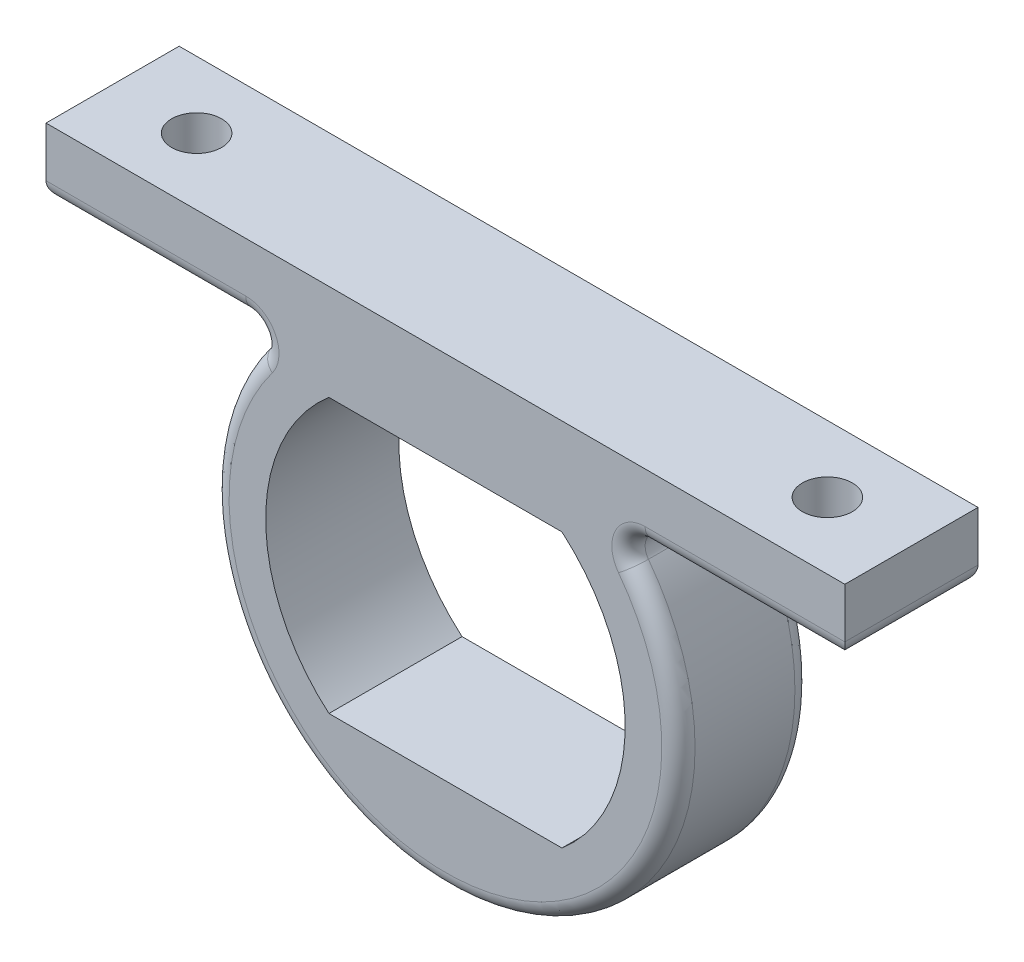
ISO-10303-21;
HEADER;
FILE_DESCRIPTION(('STEP AP214'),'2;1');
FILE_NAME('part.step','',(''),(''),'','','');
FILE_SCHEMA(('AUTOMOTIVE_DESIGN { 1 0 10303 214 1 1 1 1 }'));
ENDSEC;
DATA;
#1=APPLICATION_CONTEXT('core data for automotive mechanical design processes');
#2=APPLICATION_PROTOCOL_DEFINITION('international standard','automotive_design',2000,#1);
#3=PRODUCT_CONTEXT('',#1,'mechanical');
#4=PRODUCT('Part','Part','',(#3));
#5=PRODUCT_RELATED_PRODUCT_CATEGORY('part','',(#4));
#6=PRODUCT_DEFINITION_FORMATION('','',#4);
#7=PRODUCT_DEFINITION_CONTEXT('part definition',#1,'design');
#8=PRODUCT_DEFINITION('design','',#6,#7);
#9=PRODUCT_DEFINITION_SHAPE('','',#8);
#10=(LENGTH_UNIT() NAMED_UNIT(*) SI_UNIT(.MILLI.,.METRE.));
#11=(NAMED_UNIT(*) PLANE_ANGLE_UNIT() SI_UNIT($,.RADIAN.));
#12=(NAMED_UNIT(*) SI_UNIT($,.STERADIAN.) SOLID_ANGLE_UNIT());
#13=UNCERTAINTY_MEASURE_WITH_UNIT(LENGTH_MEASURE(1.E-05),#10,'distance_accuracy_value','');
#14=(GEOMETRIC_REPRESENTATION_CONTEXT(3) GLOBAL_UNCERTAINTY_ASSIGNED_CONTEXT((#13)) GLOBAL_UNIT_ASSIGNED_CONTEXT((#10,
#11,#12)) REPRESENTATION_CONTEXT('',''));
#15=CARTESIAN_POINT('',(0.,0.,0.));
#16=DIRECTION('',(0.,0.,1.));
#17=DIRECTION('',(1.,0.,0.));
#18=AXIS2_PLACEMENT_3D('',#15,#16,#17);
#19=CARTESIAN_POINT('',(0.,14.,8.));
#20=DIRECTION('',(0.,-1.,0.));
#21=DIRECTION('',(1.,0.,0.));
#22=AXIS2_PLACEMENT_3D('',#19,#20,#21);
#23=PLANE('',#22);
#24=CARTESIAN_POINT('',(18.9494897427832,14.,4.));
#25=DIRECTION('',(0.,-1.,0.));
#26=DIRECTION('',(0.,0.,-1.));
#27=AXIS2_PLACEMENT_3D('',#24,#25,#26);
#28=CIRCLE('',#27,1.5);
#29=CARTESIAN_POINT('',(18.9494897427832,14.,2.5));
#30=VERTEX_POINT('',#29);
#31=EDGE_CURVE('E445',#30,#30,#28,.T.);
#32=ORIENTED_EDGE('',*,*,#31,.T.);
#33=EDGE_LOOP('',(#32));
#34=FACE_BOUND('',#33,.T.);
#35=CARTESIAN_POINT('',(-18.9494897427832,14.,4.));
#36=DIRECTION('',(0.,-1.,0.));
#37=DIRECTION('',(0.,0.,-1.));
#38=AXIS2_PLACEMENT_3D('',#35,#36,#37);
#39=CIRCLE('',#38,1.5);
#40=CARTESIAN_POINT('',(-18.9494897427832,14.,2.5));
#41=VERTEX_POINT('',#40);
#42=EDGE_CURVE('E279',#41,#41,#39,.T.);
#43=ORIENTED_EDGE('',*,*,#42,.T.);
#44=EDGE_LOOP('',(#43));
#45=FACE_BOUND('',#44,.T.);
#46=DIRECTION('',(-1.,0.,0.));
#47=VECTOR('',#46,1.);
#48=CARTESIAN_POINT('',(0.,14.,0.));
#49=LINE('',#48,#47);
#50=CARTESIAN_POINT('',(24.,14.,0.));
#51=VERTEX_POINT('',#50);
#52=CARTESIAN_POINT('',(-24.,14.,0.));
#53=VERTEX_POINT('',#52);
#54=EDGE_CURVE('E212',#51,#53,#49,.T.);
#55=ORIENTED_EDGE('',*,*,#54,.T.);
#56=DIRECTION('',(0.,0.,-1.));
#57=VECTOR('',#56,1.);
#58=CARTESIAN_POINT('',(-24.,14.,8.));
#59=LINE('',#58,#57);
#60=CARTESIAN_POINT('',(-24.,14.,8.));
#61=VERTEX_POINT('',#60);
#62=EDGE_CURVE('E225',#61,#53,#59,.T.);
#63=ORIENTED_EDGE('',*,*,#62,.F.);
#64=DIRECTION('',(1.,0.,0.));
#65=VECTOR('',#64,1.);
#66=CARTESIAN_POINT('',(0.,14.,8.));
#67=LINE('',#66,#65);
#68=CARTESIAN_POINT('',(24.,14.,8.));
#69=VERTEX_POINT('',#68);
#70=EDGE_CURVE('E208',#61,#69,#67,.T.);
#71=ORIENTED_EDGE('',*,*,#70,.T.);
#72=DIRECTION('',(0.,0.,-1.));
#73=VECTOR('',#72,1.);
#74=CARTESIAN_POINT('',(24.,14.,8.));
#75=LINE('',#74,#73);
#76=EDGE_CURVE('E218',#69,#51,#75,.T.);
#77=ORIENTED_EDGE('',*,*,#76,.T.);
#78=EDGE_LOOP('',(#55,#63,#71,#77));
#79=FACE_BOUND('',#78,.T.);
#80=ADVANCED_FACE('F35',(#34,#45,#79),#23,.F.);
#81=CARTESIAN_POINT('',(-24.,14.,8.));
#82=DIRECTION('',(1.,0.,0.));
#83=DIRECTION('',(0.,0.,-1.));
#84=AXIS2_PLACEMENT_3D('',#81,#82,#83);
#85=PLANE('',#84);
#86=DIRECTION('',(0.,-1.,0.));
#87=VECTOR('',#86,1.);
#88=CARTESIAN_POINT('',(-24.,14.,0.));
#89=LINE('',#88,#87);
#90=CARTESIAN_POINT('',(-24.,11.,0.));
#91=VERTEX_POINT('',#90);
#92=EDGE_CURVE('E221',#53,#91,#89,.T.);
#93=ORIENTED_EDGE('',*,*,#92,.T.);
#94=DIRECTION('',(0.,0.,-1.));
#95=VECTOR('',#94,1.);
#96=CARTESIAN_POINT('',(-24.,11.,8.));
#97=LINE('',#96,#95);
#98=CARTESIAN_POINT('',(-24.,11.,8.));
#99=VERTEX_POINT('',#98);
#100=EDGE_CURVE('E269',#91,#99,#97,.F.);
#101=ORIENTED_EDGE('',*,*,#100,.T.);
#102=DIRECTION('',(0.,-1.,0.));
#103=VECTOR('',#102,1.);
#104=CARTESIAN_POINT('',(-24.,14.,8.));
#105=LINE('',#104,#103);
#106=EDGE_CURVE('E215',#61,#99,#105,.T.);
#107=ORIENTED_EDGE('',*,*,#106,.F.);
#108=ORIENTED_EDGE('',*,*,#62,.T.);
#109=EDGE_LOOP('',(#93,#101,#107,#108));
#110=FACE_BOUND('',#109,.T.);
#111=ADVANCED_FACE('F343',(#110),#85,.F.);
#112=CARTESIAN_POINT('',(-24.,10.,8.));
#113=DIRECTION('',(0.,1.,0.));
#114=DIRECTION('',(0.,0.,1.));
#115=AXIS2_PLACEMENT_3D('',#112,#113,#114);
#116=PLANE('',#115);
#117=CARTESIAN_POINT('',(-18.9494897427832,10.,4.));
#118=DIRECTION('',(0.,-1.,0.));
#119=DIRECTION('',(0.,0.,-1.));
#120=AXIS2_PLACEMENT_3D('',#117,#118,#119);
#121=CIRCLE('',#120,1.5);
#122=CARTESIAN_POINT('',(-18.9494897427832,10.,2.5));
#123=VERTEX_POINT('',#122);
#124=EDGE_CURVE('E192',#123,#123,#121,.T.);
#125=ORIENTED_EDGE('',*,*,#124,.F.);
#126=EDGE_LOOP('',(#125));
#127=FACE_BOUND('',#126,.T.);
#128=DIRECTION('',(1.,0.,0.));
#129=VECTOR('',#128,1.);
#130=CARTESIAN_POINT('',(-24.,10.,1.));
#131=LINE('',#130,#129);
#132=CARTESIAN_POINT('',(-23.,10.,1.));
#133=VERTEX_POINT('',#132);
#134=CARTESIAN_POINT('',(-12.,10.,1.));
#135=VERTEX_POINT('',#134);
#136=EDGE_CURVE('E239',#133,#135,#131,.T.);
#137=ORIENTED_EDGE('',*,*,#136,.T.);
#138=DIRECTION('',(0.,0.,1.));
#139=VECTOR('',#138,1.);
#140=CARTESIAN_POINT('',(-12.,10.,8.));
#141=LINE('',#140,#139);
#142=CARTESIAN_POINT('',(-12.,10.,7.));
#143=VERTEX_POINT('',#142);
#144=EDGE_CURVE('E244',#135,#143,#141,.T.);
#145=ORIENTED_EDGE('',*,*,#144,.T.);
#146=DIRECTION('',(1.,0.,0.));
#147=VECTOR('',#146,1.);
#148=CARTESIAN_POINT('',(-24.,10.,7.));
#149=LINE('',#148,#147);
#150=CARTESIAN_POINT('',(-23.,10.,7.));
#151=VERTEX_POINT('',#150);
#152=EDGE_CURVE('E241',#143,#151,#149,.F.);
#153=ORIENTED_EDGE('',*,*,#152,.T.);
#154=DIRECTION('',(0.,0.,-1.));
#155=VECTOR('',#154,1.);
#156=CARTESIAN_POINT('',(-23.,10.,8.));
#157=LINE('',#156,#155);
#158=EDGE_CURVE('E237',#151,#133,#157,.T.);
#159=ORIENTED_EDGE('',*,*,#158,.T.);
#160=EDGE_LOOP('',(#137,#145,#153,#159));
#161=FACE_BOUND('',#160,.T.);
#162=ADVANCED_FACE('F392',(#127,#161),#116,.F.);
#163=CARTESIAN_POINT('',(0.,0.,8.));
#164=DIRECTION('',(0.,0.,-1.));
#165=DIRECTION('',(-1.,0.,0.));
#166=AXIS2_PLACEMENT_3D('',#163,#164,#165);
#167=CYLINDRICAL_SURFACE('',#166,14.);
#168=CARTESIAN_POINT('',(0.,0.,7.));
#169=DIRECTION('',(0.,0.,1.));
#170=DIRECTION('',(1.,0.,0.));
#171=AXIS2_PLACEMENT_3D('',#168,#169,#170);
#172=CIRCLE('',#171,14.);
#173=CARTESIAN_POINT('',(11.2,8.4,7.));
#174=VERTEX_POINT('',#173);
#175=CARTESIAN_POINT('',(-11.2,8.4,7.));
#176=VERTEX_POINT('',#175);
#177=EDGE_CURVE('E52',#174,#176,#172,.F.);
#178=ORIENTED_EDGE('',*,*,#177,.T.);
#179=DIRECTION('',(0.,0.,-1.));
#180=VECTOR('',#179,1.);
#181=CARTESIAN_POINT('',(-11.2,8.4,8.));
#182=LINE('',#181,#180);
#183=CARTESIAN_POINT('',(-11.2,8.4,1.));
#184=VERTEX_POINT('',#183);
#185=EDGE_CURVE('E265',#176,#184,#182,.T.);
#186=ORIENTED_EDGE('',*,*,#185,.T.);
#187=CARTESIAN_POINT('',(0.,0.,1.));
#188=DIRECTION('',(0.,0.,1.));
#189=DIRECTION('',(1.,0.,0.));
#190=AXIS2_PLACEMENT_3D('',#187,#188,#189);
#191=CIRCLE('',#190,14.);
#192=CARTESIAN_POINT('',(11.2,8.4,1.));
#193=VERTEX_POINT('',#192);
#194=EDGE_CURVE('E261',#184,#193,#191,.T.);
#195=ORIENTED_EDGE('',*,*,#194,.T.);
#196=DIRECTION('',(0.,0.,-1.));
#197=VECTOR('',#196,1.);
#198=CARTESIAN_POINT('',(11.2,8.4,8.));
#199=LINE('',#198,#197);
#200=EDGE_CURVE('E57',#193,#174,#199,.F.);
#201=ORIENTED_EDGE('',*,*,#200,.T.);
#202=EDGE_LOOP('',(#178,#186,#195,#201));
#203=FACE_BOUND('',#202,.T.);
#204=ADVANCED_FACE('F396',(#203),#167,.T.);
#205=CARTESIAN_POINT('',(24.,10.,8.));
#206=DIRECTION('',(0.,-1.,0.));
#207=DIRECTION('',(0.,0.,-1.));
#208=AXIS2_PLACEMENT_3D('',#205,#206,#207);
#209=PLANE('',#208);
#210=CARTESIAN_POINT('',(18.9494897427832,10.,4.));
#211=DIRECTION('',(0.,-1.,0.));
#212=DIRECTION('',(0.,0.,-1.));
#213=AXIS2_PLACEMENT_3D('',#210,#211,#212);
#214=CIRCLE('',#213,1.5);
#215=CARTESIAN_POINT('',(18.9494897427832,10.,2.5));
#216=VERTEX_POINT('',#215);
#217=EDGE_CURVE('E448',#216,#216,#214,.T.);
#218=ORIENTED_EDGE('',*,*,#217,.F.);
#219=EDGE_LOOP('',(#218));
#220=FACE_BOUND('',#219,.T.);
#221=DIRECTION('',(-1.,0.,0.));
#222=VECTOR('',#221,1.);
#223=CARTESIAN_POINT('',(24.,10.,7.));
#224=LINE('',#223,#222);
#225=CARTESIAN_POINT('',(23.,10.,7.));
#226=VERTEX_POINT('',#225);
#227=CARTESIAN_POINT('',(12.,10.,7.));
#228=VERTEX_POINT('',#227);
#229=EDGE_CURVE('E256',#226,#228,#224,.T.);
#230=ORIENTED_EDGE('',*,*,#229,.T.);
#231=DIRECTION('',(0.,0.,-1.));
#232=VECTOR('',#231,1.);
#233=CARTESIAN_POINT('',(12.,10.,8.));
#234=LINE('',#233,#232);
#235=CARTESIAN_POINT('',(12.,10.,1.));
#236=VERTEX_POINT('',#235);
#237=EDGE_CURVE('E259',#228,#236,#234,.T.);
#238=ORIENTED_EDGE('',*,*,#237,.T.);
#239=DIRECTION('',(-1.,0.,0.));
#240=VECTOR('',#239,1.);
#241=CARTESIAN_POINT('',(24.,10.,1.));
#242=LINE('',#241,#240);
#243=CARTESIAN_POINT('',(23.,10.,1.));
#244=VERTEX_POINT('',#243);
#245=EDGE_CURVE('E254',#236,#244,#242,.F.);
#246=ORIENTED_EDGE('',*,*,#245,.T.);
#247=DIRECTION('',(0.,0.,-1.));
#248=VECTOR('',#247,1.);
#249=CARTESIAN_POINT('',(23.,10.,8.));
#250=LINE('',#249,#248);
#251=EDGE_CURVE('E252',#244,#226,#250,.F.);
#252=ORIENTED_EDGE('',*,*,#251,.T.);
#253=EDGE_LOOP('',(#230,#238,#246,#252));
#254=FACE_BOUND('',#253,.T.);
#255=ADVANCED_FACE('F371',(#220,#254),#209,.T.);
#256=CARTESIAN_POINT('',(24.,14.,8.));
#257=DIRECTION('',(1.,0.,0.));
#258=DIRECTION('',(0.,0.,-1.));
#259=AXIS2_PLACEMENT_3D('',#256,#257,#258);
#260=PLANE('',#259);
#261=DIRECTION('',(0.,-1.,0.));
#262=VECTOR('',#261,1.);
#263=CARTESIAN_POINT('',(24.,14.,8.));
#264=LINE('',#263,#262);
#265=CARTESIAN_POINT('',(24.,11.,8.));
#266=VERTEX_POINT('',#265);
#267=EDGE_CURVE('E211',#69,#266,#264,.T.);
#268=ORIENTED_EDGE('',*,*,#267,.T.);
#269=DIRECTION('',(0.,0.,-1.));
#270=VECTOR('',#269,1.);
#271=CARTESIAN_POINT('',(24.,11.,8.));
#272=LINE('',#271,#270);
#273=CARTESIAN_POINT('',(24.,11.,0.));
#274=VERTEX_POINT('',#273);
#275=EDGE_CURVE('E267',#266,#274,#272,.T.);
#276=ORIENTED_EDGE('',*,*,#275,.T.);
#277=DIRECTION('',(0.,-1.,0.));
#278=VECTOR('',#277,1.);
#279=CARTESIAN_POINT('',(24.,14.,0.));
#280=LINE('',#279,#278);
#281=EDGE_CURVE('E204',#51,#274,#280,.T.);
#282=ORIENTED_EDGE('',*,*,#281,.F.);
#283=ORIENTED_EDGE('',*,*,#76,.F.);
#284=EDGE_LOOP('',(#268,#276,#282,#283));
#285=FACE_BOUND('',#284,.T.);
#286=ADVANCED_FACE('F334',(#285),#260,.T.);
#287=CARTESIAN_POINT('',(0.,0.,8.));
#288=DIRECTION('',(0.,0.,1.));
#289=DIRECTION('',(1.,0.,0.));
#290=AXIS2_PLACEMENT_3D('',#287,#288,#289);
#291=PLANE('',#290);
#292=CARTESIAN_POINT('',(0.,0.,8.));
#293=DIRECTION('',(0.,0.,1.));
#294=DIRECTION('',(1.,0.,0.));
#295=AXIS2_PLACEMENT_3D('',#292,#293,#294);
#296=CIRCLE('',#295,10.8);
#297=CARTESIAN_POINT('',(-7.,8.22435407798083,8.));
#298=VERTEX_POINT('',#297);
#299=CARTESIAN_POINT('',(-7.,-8.22435407798083,8.));
#300=VERTEX_POINT('',#299);
#301=EDGE_CURVE('E168',#298,#300,#296,.T.);
#302=ORIENTED_EDGE('',*,*,#301,.F.);
#303=DIRECTION('',(-1.,0.,0.));
#304=VECTOR('',#303,1.);
#305=CARTESIAN_POINT('',(-7.,8.22435407798083,8.));
#306=LINE('',#305,#304);
#307=CARTESIAN_POINT('',(7.,8.22435407798084,8.));
#308=VERTEX_POINT('',#307);
#309=EDGE_CURVE('E186',#308,#298,#306,.T.);
#310=ORIENTED_EDGE('',*,*,#309,.F.);
#311=CARTESIAN_POINT('',(0.,0.,8.));
#312=DIRECTION('',(0.,0.,1.));
#313=DIRECTION('',(-1.,0.,0.));
#314=AXIS2_PLACEMENT_3D('',#311,#312,#313);
#315=CIRCLE('',#314,10.8);
#316=CARTESIAN_POINT('',(7.,-8.22435407798083,8.));
#317=VERTEX_POINT('',#316);
#318=EDGE_CURVE('E189',#317,#308,#315,.T.);
#319=ORIENTED_EDGE('',*,*,#318,.F.);
#320=DIRECTION('',(1.,0.,0.));
#321=VECTOR('',#320,1.);
#322=CARTESIAN_POINT('',(-7.,-8.22435407798083,8.));
#323=LINE('',#322,#321);
#324=EDGE_CURVE('E198',#300,#317,#323,.T.);
#325=ORIENTED_EDGE('',*,*,#324,.F.);
#326=EDGE_LOOP('',(#302,#310,#319,#325));
#327=FACE_BOUND('',#326,.T.);
#328=CARTESIAN_POINT('',(0.,0.,8.));
#329=DIRECTION('',(0.,0.,1.));
#330=DIRECTION('',(1.,0.,0.));
#331=AXIS2_PLACEMENT_3D('',#328,#329,#330);
#332=CIRCLE('',#331,13.);
#333=CARTESIAN_POINT('',(-10.4,7.8,8.));
#334=VERTEX_POINT('',#333);
#335=CARTESIAN_POINT('',(10.4,7.8,8.));
#336=VERTEX_POINT('',#335);
#337=EDGE_CURVE('E228',#334,#336,#332,.T.);
#338=ORIENTED_EDGE('',*,*,#337,.T.);
#339=CARTESIAN_POINT('',(12.,9.,8.));
#340=DIRECTION('',(0.,0.,1.));
#341=DIRECTION('',(1.,0.,0.));
#342=AXIS2_PLACEMENT_3D('',#339,#340,#341);
#343=CIRCLE('',#342,2.);
#344=CARTESIAN_POINT('',(12.,11.,8.));
#345=VERTEX_POINT('',#344);
#346=EDGE_CURVE('E44',#336,#345,#343,.F.);
#347=ORIENTED_EDGE('',*,*,#346,.T.);
#348=DIRECTION('',(-1.,0.,0.));
#349=VECTOR('',#348,1.);
#350=CARTESIAN_POINT('',(0.,11.,8.));
#351=LINE('',#350,#349);
#352=EDGE_CURVE('E232',#345,#266,#351,.F.);
#353=ORIENTED_EDGE('',*,*,#352,.T.);
#354=ORIENTED_EDGE('',*,*,#267,.F.);
#355=ORIENTED_EDGE('',*,*,#70,.F.);
#356=ORIENTED_EDGE('',*,*,#106,.T.);
#357=DIRECTION('',(1.,0.,0.));
#358=VECTOR('',#357,1.);
#359=CARTESIAN_POINT('',(-9.79795897113272,11.,8.));
#360=LINE('',#359,#358);
#361=CARTESIAN_POINT('',(-12.,11.,8.));
#362=VERTEX_POINT('',#361);
#363=EDGE_CURVE('E234',#99,#362,#360,.T.);
#364=ORIENTED_EDGE('',*,*,#363,.T.);
#365=CARTESIAN_POINT('',(-12.,9.,8.));
#366=DIRECTION('',(0.,0.,1.));
#367=DIRECTION('',(1.,0.,0.));
#368=AXIS2_PLACEMENT_3D('',#365,#366,#367);
#369=CIRCLE('',#368,2.);
#370=EDGE_CURVE('E271',#362,#334,#369,.F.);
#371=ORIENTED_EDGE('',*,*,#370,.T.);
#372=EDGE_LOOP('',(#338,#347,#353,#354,#355,#356,#364,#371));
#373=FACE_BOUND('',#372,.T.);
#374=ADVANCED_FACE('F337',(#327,#373),#291,.T.);
#375=CARTESIAN_POINT('',(0.,0.,0.));
#376=DIRECTION('',(0.,0.,1.));
#377=DIRECTION('',(1.,0.,0.));
#378=AXIS2_PLACEMENT_3D('',#375,#376,#377);
#379=PLANE('',#378);
#380=DIRECTION('',(-1.,0.,0.));
#381=VECTOR('',#380,1.);
#382=CARTESIAN_POINT('',(-7.,8.22435407798083,0.));
#383=LINE('',#382,#381);
#384=CARTESIAN_POINT('',(7.,8.22435407798084,0.));
#385=VERTEX_POINT('',#384);
#386=CARTESIAN_POINT('',(-7.,8.22435407798083,0.));
#387=VERTEX_POINT('',#386);
#388=EDGE_CURVE('E173',#385,#387,#383,.T.);
#389=ORIENTED_EDGE('',*,*,#388,.T.);
#390=CARTESIAN_POINT('',(0.,0.,0.));
#391=DIRECTION('',(0.,0.,1.));
#392=DIRECTION('',(1.,0.,0.));
#393=AXIS2_PLACEMENT_3D('',#390,#391,#392);
#394=CIRCLE('',#393,10.8);
#395=CARTESIAN_POINT('',(-7.,-8.22435407798083,0.));
#396=VERTEX_POINT('',#395);
#397=EDGE_CURVE('E165',#387,#396,#394,.T.);
#398=ORIENTED_EDGE('',*,*,#397,.T.);
#399=DIRECTION('',(1.,0.,0.));
#400=VECTOR('',#399,1.);
#401=CARTESIAN_POINT('',(-7.,-8.22435407798083,0.));
#402=LINE('',#401,#400);
#403=CARTESIAN_POINT('',(7.,-8.22435407798083,0.));
#404=VERTEX_POINT('',#403);
#405=EDGE_CURVE('E177',#396,#404,#402,.T.);
#406=ORIENTED_EDGE('',*,*,#405,.T.);
#407=CARTESIAN_POINT('',(0.,0.,0.));
#408=DIRECTION('',(0.,0.,1.));
#409=DIRECTION('',(-1.,0.,0.));
#410=AXIS2_PLACEMENT_3D('',#407,#408,#409);
#411=CIRCLE('',#410,10.8);
#412=EDGE_CURVE('E181',#404,#385,#411,.T.);
#413=ORIENTED_EDGE('',*,*,#412,.T.);
#414=EDGE_LOOP('',(#389,#398,#406,#413));
#415=FACE_BOUND('',#414,.T.);
#416=CARTESIAN_POINT('',(0.,0.,0.));
#417=DIRECTION('',(0.,0.,1.));
#418=DIRECTION('',(1.,0.,0.));
#419=AXIS2_PLACEMENT_3D('',#416,#417,#418);
#420=CIRCLE('',#419,13.);
#421=CARTESIAN_POINT('',(10.4,7.8,0.));
#422=VERTEX_POINT('',#421);
#423=CARTESIAN_POINT('',(-10.4,7.8,0.));
#424=VERTEX_POINT('',#423);
#425=EDGE_CURVE('E246',#422,#424,#420,.F.);
#426=ORIENTED_EDGE('',*,*,#425,.T.);
#427=CARTESIAN_POINT('',(-12.,9.,0.));
#428=DIRECTION('',(0.,0.,1.));
#429=DIRECTION('',(1.,0.,0.));
#430=AXIS2_PLACEMENT_3D('',#427,#428,#429);
#431=CIRCLE('',#430,2.);
#432=CARTESIAN_POINT('',(-12.,11.,0.));
#433=VERTEX_POINT('',#432);
#434=EDGE_CURVE('E11',#424,#433,#431,.T.);
#435=ORIENTED_EDGE('',*,*,#434,.T.);
#436=DIRECTION('',(1.,0.,0.));
#437=VECTOR('',#436,1.);
#438=CARTESIAN_POINT('',(0.,11.,0.));
#439=LINE('',#438,#437);
#440=EDGE_CURVE('E250',#433,#91,#439,.F.);
#441=ORIENTED_EDGE('',*,*,#440,.T.);
#442=ORIENTED_EDGE('',*,*,#92,.F.);
#443=ORIENTED_EDGE('',*,*,#54,.F.);
#444=ORIENTED_EDGE('',*,*,#281,.T.);
#445=DIRECTION('',(-1.,0.,0.));
#446=VECTOR('',#445,1.);
#447=CARTESIAN_POINT('',(9.79795897113271,11.,0.));
#448=LINE('',#447,#446);
#449=CARTESIAN_POINT('',(12.,11.,0.));
#450=VERTEX_POINT('',#449);
#451=EDGE_CURVE('E248',#274,#450,#448,.T.);
#452=ORIENTED_EDGE('',*,*,#451,.T.);
#453=CARTESIAN_POINT('',(12.,9.,0.));
#454=DIRECTION('',(0.,0.,1.));
#455=DIRECTION('',(1.,0.,0.));
#456=AXIS2_PLACEMENT_3D('',#453,#454,#455);
#457=CIRCLE('',#456,2.);
#458=EDGE_CURVE('E273',#450,#422,#457,.T.);
#459=ORIENTED_EDGE('',*,*,#458,.T.);
#460=EDGE_LOOP('',(#426,#435,#441,#442,#443,#444,#452,#459));
#461=FACE_BOUND('',#460,.T.);
#462=ADVANCED_FACE('F183',(#415,#461),#379,.F.);
#463=CARTESIAN_POINT('',(0.,0.,0.));
#464=DIRECTION('',(0.,0.,1.));
#465=DIRECTION('',(1.,0.,0.));
#466=AXIS2_PLACEMENT_3D('',#463,#464,#465);
#467=CYLINDRICAL_SURFACE('',#466,10.8);
#468=ORIENTED_EDGE('',*,*,#301,.T.);
#469=DIRECTION('',(0.,0.,1.));
#470=VECTOR('',#469,1.);
#471=CARTESIAN_POINT('',(-7.,-8.22435407798083,0.));
#472=LINE('',#471,#470);
#473=EDGE_CURVE('E161',#396,#300,#472,.T.);
#474=ORIENTED_EDGE('',*,*,#473,.F.);
#475=ORIENTED_EDGE('',*,*,#397,.F.);
#476=DIRECTION('',(0.,0.,1.));
#477=VECTOR('',#476,1.);
#478=CARTESIAN_POINT('',(-7.,8.22435407798083,0.));
#479=LINE('',#478,#477);
#480=EDGE_CURVE('E202',#387,#298,#479,.T.);
#481=ORIENTED_EDGE('',*,*,#480,.T.);
#482=EDGE_LOOP('',(#468,#474,#475,#481));
#483=FACE_BOUND('',#482,.T.);
#484=ADVANCED_FACE('F163',(#483),#467,.F.);
#485=CARTESIAN_POINT('',(-7.,8.22435407798083,0.));
#486=DIRECTION('',(0.,1.,0.));
#487=DIRECTION('',(0.,0.,1.));
#488=AXIS2_PLACEMENT_3D('',#485,#486,#487);
#489=PLANE('',#488);
#490=ORIENTED_EDGE('',*,*,#309,.T.);
#491=ORIENTED_EDGE('',*,*,#480,.F.);
#492=ORIENTED_EDGE('',*,*,#388,.F.);
#493=DIRECTION('',(0.,0.,1.));
#494=VECTOR('',#493,1.);
#495=CARTESIAN_POINT('',(7.,8.22435407798084,0.));
#496=LINE('',#495,#494);
#497=EDGE_CURVE('E205',#385,#308,#496,.T.);
#498=ORIENTED_EDGE('',*,*,#497,.T.);
#499=EDGE_LOOP('',(#490,#491,#492,#498));
#500=FACE_BOUND('',#499,.T.);
#501=ADVANCED_FACE('F424',(#500),#489,.F.);
#502=CARTESIAN_POINT('',(0.,0.,0.));
#503=DIRECTION('',(0.,0.,1.));
#504=DIRECTION('',(1.,0.,0.));
#505=AXIS2_PLACEMENT_3D('',#502,#503,#504);
#506=CYLINDRICAL_SURFACE('',#505,10.8);
#507=ORIENTED_EDGE('',*,*,#318,.T.);
#508=ORIENTED_EDGE('',*,*,#497,.F.);
#509=ORIENTED_EDGE('',*,*,#412,.F.);
#510=DIRECTION('',(0.,0.,1.));
#511=VECTOR('',#510,1.);
#512=CARTESIAN_POINT('',(7.,-8.22435407798083,0.));
#513=LINE('',#512,#511);
#514=EDGE_CURVE('E172',#404,#317,#513,.T.);
#515=ORIENTED_EDGE('',*,*,#514,.T.);
#516=EDGE_LOOP('',(#507,#508,#509,#515));
#517=FACE_BOUND('',#516,.T.);
#518=ADVANCED_FACE('F427',(#517),#506,.F.);
#519=CARTESIAN_POINT('',(-7.,-8.22435407798083,0.));
#520=DIRECTION('',(0.,-1.,0.));
#521=DIRECTION('',(0.,0.,-1.));
#522=AXIS2_PLACEMENT_3D('',#519,#520,#521);
#523=PLANE('',#522);
#524=ORIENTED_EDGE('',*,*,#324,.T.);
#525=ORIENTED_EDGE('',*,*,#514,.F.);
#526=ORIENTED_EDGE('',*,*,#405,.F.);
#527=ORIENTED_EDGE('',*,*,#473,.T.);
#528=EDGE_LOOP('',(#524,#525,#526,#527));
#529=FACE_BOUND('',#528,.T.);
#530=ADVANCED_FACE('F178',(#529),#523,.F.);
#531=CARTESIAN_POINT('',(0.,11.,1.));
#532=DIRECTION('',(1.,0.,0.));
#533=DIRECTION('',(0.,0.,-1.));
#534=AXIS2_PLACEMENT_3D('',#531,#532,#533);
#535=CYLINDRICAL_SURFACE('',#534,1.);
#536=CARTESIAN_POINT('',(12.,11.,1.));
#537=DIRECTION('',(-1.,0.,0.));
#538=DIRECTION('',(0.,0.,1.));
#539=AXIS2_PLACEMENT_3D('',#536,#537,#538);
#540=CIRCLE('',#539,1.);
#541=EDGE_CURVE('E314',#450,#236,#540,.T.);
#542=ORIENTED_EDGE('',*,*,#541,.F.);
#543=ORIENTED_EDGE('',*,*,#451,.F.);
#544=CARTESIAN_POINT('',(23.,11.,1.));
#545=DIRECTION('',(-0.707106781186547,0.,-0.707106781186547));
#546=DIRECTION('',(0.707106781186547,0.,-0.707106781186547));
#547=AXIS2_PLACEMENT_3D('',#544,#545,#546);
#548=ELLIPSE('',#547,1.41421356237309,1.);
#549=EDGE_CURVE('E39',#244,#274,#548,.F.);
#550=ORIENTED_EDGE('',*,*,#549,.F.);
#551=ORIENTED_EDGE('',*,*,#245,.F.);
#552=EDGE_LOOP('',(#542,#543,#550,#551));
#553=FACE_BOUND('',#552,.T.);
#554=ADVANCED_FACE('F37',(#553),#535,.T.);
#555=CARTESIAN_POINT('',(23.,11.,8.));
#556=DIRECTION('',(0.,0.,-1.));
#557=DIRECTION('',(-1.,0.,0.));
#558=AXIS2_PLACEMENT_3D('',#555,#556,#557);
#559=CYLINDRICAL_SURFACE('',#558,1.);
#560=ORIENTED_EDGE('',*,*,#549,.T.);
#561=ORIENTED_EDGE('',*,*,#275,.F.);
#562=CARTESIAN_POINT('',(23.,11.,7.));
#563=DIRECTION('',(0.707106781186547,0.,-0.707106781186547));
#564=DIRECTION('',(-0.707106781186547,0.,-0.707106781186547));
#565=AXIS2_PLACEMENT_3D('',#562,#563,#564);
#566=ELLIPSE('',#565,1.41421356237309,1.);
#567=EDGE_CURVE('E312',#226,#266,#566,.F.);
#568=ORIENTED_EDGE('',*,*,#567,.F.);
#569=ORIENTED_EDGE('',*,*,#251,.F.);
#570=EDGE_LOOP('',(#560,#561,#568,#569));
#571=FACE_BOUND('',#570,.T.);
#572=ADVANCED_FACE('F325',(#571),#559,.T.);
#573=CARTESIAN_POINT('',(12.,9.,1.));
#574=DIRECTION('',(0.,0.,1.));
#575=DIRECTION('',(1.,0.,0.));
#576=AXIS2_PLACEMENT_3D('',#573,#574,#575);
#577=TOROIDAL_SURFACE('',#576,2.,1.);
#578=ORIENTED_EDGE('',*,*,#458,.F.);
#579=ORIENTED_EDGE('',*,*,#541,.T.);
#580=CARTESIAN_POINT('',(12.,9.,1.));
#581=DIRECTION('',(0.,0.,1.));
#582=DIRECTION('',(1.,0.,0.));
#583=AXIS2_PLACEMENT_3D('',#580,#581,#582);
#584=CIRCLE('',#583,1.);
#585=EDGE_CURVE('E309',#193,#236,#584,.F.);
#586=ORIENTED_EDGE('',*,*,#585,.F.);
#587=CARTESIAN_POINT('',(10.4,7.8,1.));
#588=DIRECTION('',(-0.6,0.8,0.));
#589=DIRECTION('',(-0.8,-0.6,0.));
#590=AXIS2_PLACEMENT_3D('',#587,#588,#589);
#591=CIRCLE('',#590,1.);
#592=EDGE_CURVE('E306',#422,#193,#591,.F.);
#593=ORIENTED_EDGE('',*,*,#592,.F.);
#594=EDGE_LOOP('',(#578,#579,#586,#593));
#595=FACE_BOUND('',#594,.T.);
#596=ADVANCED_FACE('F374',(#595),#577,.T.);
#597=CARTESIAN_POINT('',(24.,11.,7.));
#598=DIRECTION('',(-1.,0.,0.));
#599=DIRECTION('',(0.,0.,1.));
#600=AXIS2_PLACEMENT_3D('',#597,#598,#599);
#601=CYLINDRICAL_SURFACE('',#600,1.);
#602=ORIENTED_EDGE('',*,*,#567,.T.);
#603=ORIENTED_EDGE('',*,*,#352,.F.);
#604=CARTESIAN_POINT('',(12.,11.,7.));
#605=DIRECTION('',(-1.,0.,0.));
#606=DIRECTION('',(0.,0.,1.));
#607=AXIS2_PLACEMENT_3D('',#604,#605,#606);
#608=CIRCLE('',#607,1.);
#609=EDGE_CURVE('E303',#228,#345,#608,.T.);
#610=ORIENTED_EDGE('',*,*,#609,.F.);
#611=ORIENTED_EDGE('',*,*,#229,.F.);
#612=EDGE_LOOP('',(#602,#603,#610,#611));
#613=FACE_BOUND('',#612,.T.);
#614=ADVANCED_FACE('F367',(#613),#601,.T.);
#615=CARTESIAN_POINT('',(12.,9.,8.));
#616=DIRECTION('',(0.,0.,-1.));
#617=DIRECTION('',(-1.,0.,0.));
#618=AXIS2_PLACEMENT_3D('',#615,#616,#617);
#619=CYLINDRICAL_SURFACE('',#618,1.);
#620=ORIENTED_EDGE('',*,*,#585,.T.);
#621=ORIENTED_EDGE('',*,*,#237,.F.);
#622=CARTESIAN_POINT('',(12.,9.,7.));
#623=DIRECTION('',(0.,0.,1.));
#624=DIRECTION('',(1.,0.,0.));
#625=AXIS2_PLACEMENT_3D('',#622,#623,#624);
#626=CIRCLE('',#625,1.);
#627=EDGE_CURVE('E301',#174,#228,#626,.F.);
#628=ORIENTED_EDGE('',*,*,#627,.F.);
#629=ORIENTED_EDGE('',*,*,#200,.F.);
#630=EDGE_LOOP('',(#620,#621,#628,#629));
#631=FACE_BOUND('',#630,.T.);
#632=ADVANCED_FACE('F373',(#631),#619,.F.);
#633=CARTESIAN_POINT('',(0.,0.,1.));
#634=DIRECTION('',(0.,0.,1.));
#635=DIRECTION('',(1.,0.,0.));
#636=AXIS2_PLACEMENT_3D('',#633,#634,#635);
#637=TOROIDAL_SURFACE('',#636,13.,1.);
#638=ORIENTED_EDGE('',*,*,#592,.T.);
#639=ORIENTED_EDGE('',*,*,#194,.F.);
#640=CARTESIAN_POINT('',(-10.4,7.8,1.));
#641=DIRECTION('',(0.6,0.8,0.));
#642=DIRECTION('',(-0.8,0.6,0.));
#643=AXIS2_PLACEMENT_3D('',#640,#641,#642);
#644=CIRCLE('',#643,1.);
#645=EDGE_CURVE('E298',#424,#184,#644,.T.);
#646=ORIENTED_EDGE('',*,*,#645,.F.);
#647=ORIENTED_EDGE('',*,*,#425,.F.);
#648=EDGE_LOOP('',(#638,#639,#646,#647));
#649=FACE_BOUND('',#648,.T.);
#650=ADVANCED_FACE('F379',(#649),#637,.T.);
#651=CARTESIAN_POINT('',(12.,9.,7.));
#652=DIRECTION('',(0.,0.,1.));
#653=DIRECTION('',(1.,0.,0.));
#654=AXIS2_PLACEMENT_3D('',#651,#652,#653);
#655=TOROIDAL_SURFACE('',#654,2.,1.);
#656=ORIENTED_EDGE('',*,*,#609,.T.);
#657=ORIENTED_EDGE('',*,*,#346,.F.);
#658=CARTESIAN_POINT('',(10.4,7.8,7.));
#659=DIRECTION('',(-0.6,0.8,0.));
#660=DIRECTION('',(-0.8,-0.6,0.));
#661=AXIS2_PLACEMENT_3D('',#658,#659,#660);
#662=CIRCLE('',#661,1.);
#663=EDGE_CURVE('E292',#174,#336,#662,.F.);
#664=ORIENTED_EDGE('',*,*,#663,.F.);
#665=ORIENTED_EDGE('',*,*,#627,.T.);
#666=EDGE_LOOP('',(#656,#657,#664,#665));
#667=FACE_BOUND('',#666,.T.);
#668=ADVANCED_FACE('F364',(#667),#655,.T.);
#669=CARTESIAN_POINT('',(-12.,9.,1.));
#670=DIRECTION('',(0.,0.,1.));
#671=DIRECTION('',(1.,0.,0.));
#672=AXIS2_PLACEMENT_3D('',#669,#670,#671);
#673=TOROIDAL_SURFACE('',#672,2.,1.);
#674=CARTESIAN_POINT('',(-12.,9.,1.));
#675=DIRECTION('',(0.,0.,1.));
#676=DIRECTION('',(1.,0.,0.));
#677=AXIS2_PLACEMENT_3D('',#674,#675,#676);
#678=CIRCLE('',#677,1.);
#679=EDGE_CURVE('E290',#135,#184,#678,.F.);
#680=ORIENTED_EDGE('',*,*,#679,.F.);
#681=CARTESIAN_POINT('',(-12.,11.,1.));
#682=DIRECTION('',(1.,0.,0.));
#683=DIRECTION('',(0.,0.,-1.));
#684=AXIS2_PLACEMENT_3D('',#681,#682,#683);
#685=CIRCLE('',#684,1.);
#686=EDGE_CURVE('E295',#433,#135,#685,.F.);
#687=ORIENTED_EDGE('',*,*,#686,.F.);
#688=ORIENTED_EDGE('',*,*,#434,.F.);
#689=ORIENTED_EDGE('',*,*,#645,.T.);
#690=EDGE_LOOP('',(#680,#687,#688,#689));
#691=FACE_BOUND('',#690,.T.);
#692=ADVANCED_FACE('F385',(#691),#673,.T.);
#693=CARTESIAN_POINT('',(-24.,11.,1.));
#694=DIRECTION('',(1.,0.,0.));
#695=DIRECTION('',(0.,0.,-1.));
#696=AXIS2_PLACEMENT_3D('',#693,#694,#695);
#697=CYLINDRICAL_SURFACE('',#696,1.);
#698=ORIENTED_EDGE('',*,*,#686,.T.);
#699=ORIENTED_EDGE('',*,*,#136,.F.);
#700=CARTESIAN_POINT('',(-23.,11.,1.));
#701=DIRECTION('',(0.707106781186547,0.,-0.707106781186547));
#702=DIRECTION('',(-0.707106781186547,0.,-0.707106781186547));
#703=AXIS2_PLACEMENT_3D('',#700,#701,#702);
#704=ELLIPSE('',#703,1.41421356237309,1.);
#705=EDGE_CURVE('E287',#91,#133,#704,.F.);
#706=ORIENTED_EDGE('',*,*,#705,.F.);
#707=ORIENTED_EDGE('',*,*,#440,.F.);
#708=EDGE_LOOP('',(#698,#699,#706,#707));
#709=FACE_BOUND('',#708,.T.);
#710=ADVANCED_FACE('F390',(#709),#697,.T.);
#711=CARTESIAN_POINT('',(0.,0.,7.));
#712=DIRECTION('',(0.,0.,1.));
#713=DIRECTION('',(1.,0.,0.));
#714=AXIS2_PLACEMENT_3D('',#711,#712,#713);
#715=TOROIDAL_SURFACE('',#714,13.,1.);
#716=ORIENTED_EDGE('',*,*,#663,.T.);
#717=ORIENTED_EDGE('',*,*,#337,.F.);
#718=CARTESIAN_POINT('',(-10.4,7.8,7.));
#719=DIRECTION('',(0.6,0.8,0.));
#720=DIRECTION('',(-0.8,0.6,0.));
#721=AXIS2_PLACEMENT_3D('',#718,#719,#720);
#722=CIRCLE('',#721,1.);
#723=EDGE_CURVE('E284',#176,#334,#722,.T.);
#724=ORIENTED_EDGE('',*,*,#723,.F.);
#725=ORIENTED_EDGE('',*,*,#177,.F.);
#726=EDGE_LOOP('',(#716,#717,#724,#725));
#727=FACE_BOUND('',#726,.T.);
#728=ADVANCED_FACE('F361',(#727),#715,.T.);
#729=CARTESIAN_POINT('',(-12.,9.,8.));
#730=DIRECTION('',(0.,0.,-1.));
#731=DIRECTION('',(-1.,0.,0.));
#732=AXIS2_PLACEMENT_3D('',#729,#730,#731);
#733=CYLINDRICAL_SURFACE('',#732,1.);
#734=ORIENTED_EDGE('',*,*,#679,.T.);
#735=ORIENTED_EDGE('',*,*,#185,.F.);
#736=CARTESIAN_POINT('',(-12.,9.,7.));
#737=DIRECTION('',(0.,0.,1.));
#738=DIRECTION('',(1.,0.,0.));
#739=AXIS2_PLACEMENT_3D('',#736,#737,#738);
#740=CIRCLE('',#739,1.);
#741=EDGE_CURVE('E281',#143,#176,#740,.F.);
#742=ORIENTED_EDGE('',*,*,#741,.F.);
#743=ORIENTED_EDGE('',*,*,#144,.F.);
#744=EDGE_LOOP('',(#734,#735,#742,#743));
#745=FACE_BOUND('',#744,.T.);
#746=ADVANCED_FACE('F395',(#745),#733,.F.);
#747=CARTESIAN_POINT('',(-23.,11.,8.));
#748=DIRECTION('',(0.,0.,-1.));
#749=DIRECTION('',(-1.,0.,0.));
#750=AXIS2_PLACEMENT_3D('',#747,#748,#749);
#751=CYLINDRICAL_SURFACE('',#750,1.);
#752=ORIENTED_EDGE('',*,*,#705,.T.);
#753=ORIENTED_EDGE('',*,*,#158,.F.);
#754=CARTESIAN_POINT('',(-23.,11.,7.));
#755=DIRECTION('',(-0.707106781186547,0.,-0.707106781186547));
#756=DIRECTION('',(0.707106781186547,0.,-0.707106781186547));
#757=AXIS2_PLACEMENT_3D('',#754,#755,#756);
#758=ELLIPSE('',#757,1.41421356237309,1.);
#759=EDGE_CURVE('E278',#99,#151,#758,.F.);
#760=ORIENTED_EDGE('',*,*,#759,.F.);
#761=ORIENTED_EDGE('',*,*,#100,.F.);
#762=EDGE_LOOP('',(#752,#753,#760,#761));
#763=FACE_BOUND('',#762,.T.);
#764=ADVANCED_FACE('F349',(#763),#751,.T.);
#765=CARTESIAN_POINT('',(-12.,9.,7.));
#766=DIRECTION('',(0.,0.,1.));
#767=DIRECTION('',(1.,0.,0.));
#768=AXIS2_PLACEMENT_3D('',#765,#766,#767);
#769=TOROIDAL_SURFACE('',#768,2.,1.);
#770=ORIENTED_EDGE('',*,*,#723,.T.);
#771=ORIENTED_EDGE('',*,*,#370,.F.);
#772=CARTESIAN_POINT('',(-12.,11.,7.));
#773=DIRECTION('',(1.,0.,0.));
#774=DIRECTION('',(0.,0.,-1.));
#775=AXIS2_PLACEMENT_3D('',#772,#773,#774);
#776=CIRCLE('',#775,1.);
#777=EDGE_CURVE('E276',#143,#362,#776,.F.);
#778=ORIENTED_EDGE('',*,*,#777,.F.);
#779=ORIENTED_EDGE('',*,*,#741,.T.);
#780=EDGE_LOOP('',(#770,#771,#778,#779));
#781=FACE_BOUND('',#780,.T.);
#782=ADVANCED_FACE('F356',(#781),#769,.T.);
#783=CARTESIAN_POINT('',(0.,11.,7.));
#784=DIRECTION('',(-1.,0.,0.));
#785=DIRECTION('',(0.,0.,1.));
#786=AXIS2_PLACEMENT_3D('',#783,#784,#785);
#787=CYLINDRICAL_SURFACE('',#786,1.);
#788=ORIENTED_EDGE('',*,*,#759,.T.);
#789=ORIENTED_EDGE('',*,*,#152,.F.);
#790=ORIENTED_EDGE('',*,*,#777,.T.);
#791=ORIENTED_EDGE('',*,*,#363,.F.);
#792=EDGE_LOOP('',(#788,#789,#790,#791));
#793=FACE_BOUND('',#792,.T.);
#794=ADVANCED_FACE('F352',(#793),#787,.T.);
#795=CARTESIAN_POINT('',(-18.9494897427832,14.,4.));
#796=DIRECTION('',(0.,-1.,0.));
#797=DIRECTION('',(0.,0.,-1.));
#798=AXIS2_PLACEMENT_3D('',#795,#796,#797);
#799=CYLINDRICAL_SURFACE('',#798,1.5);
#800=ORIENTED_EDGE('',*,*,#42,.F.);
#801=EDGE_LOOP('',(#800));
#802=FACE_BOUND('',#801,.T.);
#803=ORIENTED_EDGE('',*,*,#124,.T.);
#804=EDGE_LOOP('',(#803));
#805=FACE_BOUND('',#804,.T.);
#806=ADVANCED_FACE('F434',(#802,#805),#799,.F.);
#807=CARTESIAN_POINT('',(18.9494897427832,14.,4.));
#808=DIRECTION('',(0.,-1.,0.));
#809=DIRECTION('',(0.,0.,-1.));
#810=AXIS2_PLACEMENT_3D('',#807,#808,#809);
#811=CYLINDRICAL_SURFACE('',#810,1.5);
#812=ORIENTED_EDGE('',*,*,#31,.F.);
#813=EDGE_LOOP('',(#812));
#814=FACE_BOUND('',#813,.T.);
#815=ORIENTED_EDGE('',*,*,#217,.T.);
#816=EDGE_LOOP('',(#815));
#817=FACE_BOUND('',#816,.T.);
#818=ADVANCED_FACE('F437',(#814,#817),#811,.F.);
#819=CLOSED_SHELL('',(#80,#111,#162,#204,#255,#286,#374,#462,#484,#501,#518,#530,#554,#572,#596,
#614,#632,#650,#668,#692,#710,#728,#746,#764,#782,#794,#806,#818));
#820=MANIFOLD_SOLID_BREP('B2',#819);
#821=ADVANCED_BREP_SHAPE_REPRESENTATION('',(#18,#820),#14);
#822=SHAPE_DEFINITION_REPRESENTATION(#9,#821);
ENDSEC;
END-ISO-10303-21;
